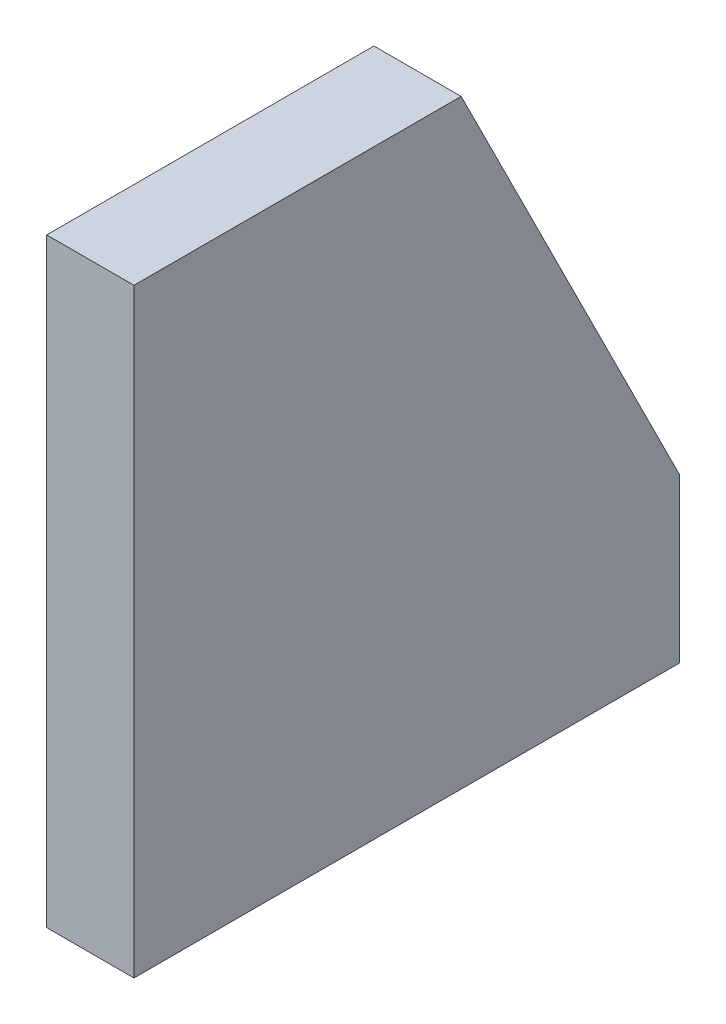
ISO-10303-21;
HEADER;
FILE_DESCRIPTION(('STEP AP214'),'2;1');
FILE_NAME('part.step','',(''),(''),'','','');
FILE_SCHEMA(('AUTOMOTIVE_DESIGN { 1 0 10303 214 1 1 1 1 }'));
ENDSEC;
DATA;
#1=APPLICATION_CONTEXT('core data for automotive mechanical design processes');
#2=APPLICATION_PROTOCOL_DEFINITION('international standard','automotive_design',2000,#1);
#3=PRODUCT_CONTEXT('',#1,'mechanical');
#4=PRODUCT('Part','Part','',(#3));
#5=PRODUCT_RELATED_PRODUCT_CATEGORY('part','',(#4));
#6=PRODUCT_DEFINITION_FORMATION('','',#4);
#7=PRODUCT_DEFINITION_CONTEXT('part definition',#1,'design');
#8=PRODUCT_DEFINITION('design','',#6,#7);
#9=PRODUCT_DEFINITION_SHAPE('','',#8);
#10=(LENGTH_UNIT() NAMED_UNIT(*) SI_UNIT(.MILLI.,.METRE.));
#11=(NAMED_UNIT(*) PLANE_ANGLE_UNIT() SI_UNIT($,.RADIAN.));
#12=(NAMED_UNIT(*) SI_UNIT($,.STERADIAN.) SOLID_ANGLE_UNIT());
#13=UNCERTAINTY_MEASURE_WITH_UNIT(LENGTH_MEASURE(1.E-05),#10,'distance_accuracy_value','');
#14=(GEOMETRIC_REPRESENTATION_CONTEXT(3) GLOBAL_UNCERTAINTY_ASSIGNED_CONTEXT((#13)) GLOBAL_UNIT_ASSIGNED_CONTEXT((#10,
#11,#12)) REPRESENTATION_CONTEXT('',''));
#15=CARTESIAN_POINT('',(0.,0.,0.));
#16=DIRECTION('',(0.,0.,1.));
#17=DIRECTION('',(1.,0.,0.));
#18=AXIS2_PLACEMENT_3D('',#15,#16,#17);
#19=CARTESIAN_POINT('',(8.,3.63636363636363,-6.16883116883118));
#20=DIRECTION('',(0.,0.,1.));
#21=DIRECTION('',(0.,-1.,0.));
#22=AXIS2_PLACEMENT_3D('',#19,#20,#21);
#23=PLANE('',#22);
#24=DIRECTION('',(0.,1.,0.));
#25=VECTOR('',#24,1.);
#26=CARTESIAN_POINT('',(0.,3.63636363636363,-6.16883116883118));
#27=LINE('',#26,#25);
#28=CARTESIAN_POINT('',(0.,-11.3636363636364,-6.16883116883118));
#29=VERTEX_POINT('',#28);
#30=CARTESIAN_POINT('',(0.,3.63636363636363,-6.16883116883118));
#31=VERTEX_POINT('',#30);
#32=EDGE_CURVE('E106',#29,#31,#27,.T.);
#33=ORIENTED_EDGE('',*,*,#32,.T.);
#34=DIRECTION('',(-1.,0.,0.));
#35=VECTOR('',#34,1.);
#36=CARTESIAN_POINT('',(8.,3.63636363636363,-6.16883116883118));
#37=LINE('',#36,#35);
#38=CARTESIAN_POINT('',(8.,3.63636363636363,-6.16883116883118));
#39=VERTEX_POINT('',#38);
#40=EDGE_CURVE('E11',#39,#31,#37,.T.);
#41=ORIENTED_EDGE('',*,*,#40,.F.);
#42=DIRECTION('',(0.,1.,0.));
#43=VECTOR('',#42,1.);
#44=CARTESIAN_POINT('',(8.,3.63636363636363,-6.16883116883118));
#45=LINE('',#44,#43);
#46=CARTESIAN_POINT('',(8.,-11.3636363636364,-6.16883116883118));
#47=VERTEX_POINT('',#46);
#48=EDGE_CURVE('E114',#47,#39,#45,.T.);
#49=ORIENTED_EDGE('',*,*,#48,.F.);
#50=DIRECTION('',(-1.,0.,0.));
#51=VECTOR('',#50,1.);
#52=CARTESIAN_POINT('',(8.,-11.3636363636364,-6.16883116883118));
#53=LINE('',#52,#51);
#54=EDGE_CURVE('E102',#47,#29,#53,.T.);
#55=ORIENTED_EDGE('',*,*,#54,.T.);
#56=EDGE_LOOP('',(#33,#41,#49,#55));
#57=FACE_BOUND('',#56,.T.);
#58=ADVANCED_FACE('F32',(#57),#23,.F.);
#59=CARTESIAN_POINT('',(8.,43.6363636363636,13.8311688311688));
#60=DIRECTION('',(0.,-0.447213595499958,0.894427190999916));
#61=DIRECTION('',(0.,-0.894427190999916,-0.447213595499958));
#62=AXIS2_PLACEMENT_3D('',#59,#60,#61);
#63=PLANE('',#62);
#64=DIRECTION('',(0.,0.894427190999916,0.447213595499958));
#65=VECTOR('',#64,1.);
#66=CARTESIAN_POINT('',(0.,43.6363636363636,13.8311688311688));
#67=LINE('',#66,#65);
#68=CARTESIAN_POINT('',(0.,43.6363636363636,13.8311688311688));
#69=VERTEX_POINT('',#68);
#70=EDGE_CURVE('E109',#31,#69,#67,.T.);
#71=ORIENTED_EDGE('',*,*,#70,.T.);
#72=DIRECTION('',(-1.,0.,0.));
#73=VECTOR('',#72,1.);
#74=CARTESIAN_POINT('',(8.,43.6363636363636,13.8311688311688));
#75=LINE('',#74,#73);
#76=CARTESIAN_POINT('',(8.,43.6363636363636,13.8311688311688));
#77=VERTEX_POINT('',#76);
#78=EDGE_CURVE('E40',#77,#69,#75,.T.);
#79=ORIENTED_EDGE('',*,*,#78,.F.);
#80=DIRECTION('',(0.,0.894427190999916,0.447213595499958));
#81=VECTOR('',#80,1.);
#82=CARTESIAN_POINT('',(8.,43.6363636363636,13.8311688311688));
#83=LINE('',#82,#81);
#84=EDGE_CURVE('E82',#39,#77,#83,.T.);
#85=ORIENTED_EDGE('',*,*,#84,.F.);
#86=ORIENTED_EDGE('',*,*,#40,.T.);
#87=EDGE_LOOP('',(#71,#79,#85,#86));
#88=FACE_BOUND('',#87,.T.);
#89=ADVANCED_FACE('F133',(#88),#63,.F.);
#90=CARTESIAN_POINT('',(8.,43.6363636363636,43.8311688311688));
#91=DIRECTION('',(0.,-1.,0.));
#92=DIRECTION('',(0.,0.,-1.));
#93=AXIS2_PLACEMENT_3D('',#90,#91,#92);
#94=PLANE('',#93);
#95=DIRECTION('',(0.,0.,1.));
#96=VECTOR('',#95,1.);
#97=CARTESIAN_POINT('',(0.,43.6363636363636,43.8311688311688));
#98=LINE('',#97,#96);
#99=CARTESIAN_POINT('',(0.,43.6363636363636,43.8311688311688));
#100=VERTEX_POINT('',#99);
#101=EDGE_CURVE('E97',#69,#100,#98,.T.);
#102=ORIENTED_EDGE('',*,*,#101,.T.);
#103=DIRECTION('',(-1.,0.,0.));
#104=VECTOR('',#103,1.);
#105=CARTESIAN_POINT('',(8.,43.6363636363636,43.8311688311688));
#106=LINE('',#105,#104);
#107=CARTESIAN_POINT('',(8.,43.6363636363636,43.8311688311688));
#108=VERTEX_POINT('',#107);
#109=EDGE_CURVE('E94',#108,#100,#106,.T.);
#110=ORIENTED_EDGE('',*,*,#109,.F.);
#111=DIRECTION('',(0.,0.,1.));
#112=VECTOR('',#111,1.);
#113=CARTESIAN_POINT('',(8.,43.6363636363636,43.8311688311688));
#114=LINE('',#113,#112);
#115=EDGE_CURVE('E86',#77,#108,#114,.T.);
#116=ORIENTED_EDGE('',*,*,#115,.F.);
#117=ORIENTED_EDGE('',*,*,#78,.T.);
#118=EDGE_LOOP('',(#102,#110,#116,#117));
#119=FACE_BOUND('',#118,.T.);
#120=ADVANCED_FACE('F95',(#119),#94,.F.);
#121=CARTESIAN_POINT('',(8.,-11.3636363636364,43.8311688311688));
#122=DIRECTION('',(0.,0.,-1.));
#123=DIRECTION('',(-1.,0.,0.));
#124=AXIS2_PLACEMENT_3D('',#121,#122,#123);
#125=PLANE('',#124);
#126=DIRECTION('',(0.,-1.,0.));
#127=VECTOR('',#126,1.);
#128=CARTESIAN_POINT('',(0.,-11.3636363636364,43.8311688311688));
#129=LINE('',#128,#127);
#130=CARTESIAN_POINT('',(0.,-11.3636363636364,43.8311688311688));
#131=VERTEX_POINT('',#130);
#132=EDGE_CURVE('E68',#100,#131,#129,.T.);
#133=ORIENTED_EDGE('',*,*,#132,.T.);
#134=DIRECTION('',(-1.,0.,0.));
#135=VECTOR('',#134,1.);
#136=CARTESIAN_POINT('',(8.,-11.3636363636364,43.8311688311688));
#137=LINE('',#136,#135);
#138=CARTESIAN_POINT('',(8.,-11.3636363636364,43.8311688311688));
#139=VERTEX_POINT('',#138);
#140=EDGE_CURVE('E98',#139,#131,#137,.T.);
#141=ORIENTED_EDGE('',*,*,#140,.F.);
#142=DIRECTION('',(0.,-1.,0.));
#143=VECTOR('',#142,1.);
#144=CARTESIAN_POINT('',(8.,-11.3636363636364,43.8311688311688));
#145=LINE('',#144,#143);
#146=EDGE_CURVE('E90',#108,#139,#145,.T.);
#147=ORIENTED_EDGE('',*,*,#146,.F.);
#148=ORIENTED_EDGE('',*,*,#109,.T.);
#149=EDGE_LOOP('',(#133,#141,#147,#148));
#150=FACE_BOUND('',#149,.T.);
#151=ADVANCED_FACE('F100',(#150),#125,.F.);
#152=CARTESIAN_POINT('',(8.,-11.3636363636364,-6.16883116883118));
#153=DIRECTION('',(0.,1.,0.));
#154=DIRECTION('',(0.,0.,1.));
#155=AXIS2_PLACEMENT_3D('',#152,#153,#154);
#156=PLANE('',#155);
#157=DIRECTION('',(0.,0.,-1.));
#158=VECTOR('',#157,1.);
#159=CARTESIAN_POINT('',(0.,-11.3636363636364,-6.16883116883118));
#160=LINE('',#159,#158);
#161=EDGE_CURVE('E74',#131,#29,#160,.T.);
#162=ORIENTED_EDGE('',*,*,#161,.T.);
#163=ORIENTED_EDGE('',*,*,#54,.F.);
#164=DIRECTION('',(0.,0.,-1.));
#165=VECTOR('',#164,1.);
#166=CARTESIAN_POINT('',(8.,-11.3636363636364,-6.16883116883118));
#167=LINE('',#166,#165);
#168=EDGE_CURVE('E48',#139,#47,#167,.T.);
#169=ORIENTED_EDGE('',*,*,#168,.F.);
#170=ORIENTED_EDGE('',*,*,#140,.T.);
#171=EDGE_LOOP('',(#162,#163,#169,#170));
#172=FACE_BOUND('',#171,.T.);
#173=ADVANCED_FACE('F122',(#172),#156,.F.);
#174=CARTESIAN_POINT('',(8.,0.,0.));
#175=DIRECTION('',(-1.,0.,0.));
#176=DIRECTION('',(0.,0.,1.));
#177=AXIS2_PLACEMENT_3D('',#174,#175,#176);
#178=PLANE('',#177);
#179=ORIENTED_EDGE('',*,*,#48,.T.);
#180=ORIENTED_EDGE('',*,*,#84,.T.);
#181=ORIENTED_EDGE('',*,*,#115,.T.);
#182=ORIENTED_EDGE('',*,*,#146,.T.);
#183=ORIENTED_EDGE('',*,*,#168,.T.);
#184=EDGE_LOOP('',(#179,#180,#181,#182,#183));
#185=FACE_BOUND('',#184,.T.);
#186=ADVANCED_FACE('F88',(#185),#178,.F.);
#187=CARTESIAN_POINT('',(0.,0.,0.));
#188=DIRECTION('',(-1.,0.,0.));
#189=DIRECTION('',(0.,0.,1.));
#190=AXIS2_PLACEMENT_3D('',#187,#188,#189);
#191=PLANE('',#190);
#192=ORIENTED_EDGE('',*,*,#32,.F.);
#193=ORIENTED_EDGE('',*,*,#161,.F.);
#194=ORIENTED_EDGE('',*,*,#132,.F.);
#195=ORIENTED_EDGE('',*,*,#101,.F.);
#196=ORIENTED_EDGE('',*,*,#70,.F.);
#197=EDGE_LOOP('',(#192,#193,#194,#195,#196));
#198=FACE_BOUND('',#197,.T.);
#199=ADVANCED_FACE('F118',(#198),#191,.T.);
#200=CLOSED_SHELL('',(#58,#89,#120,#151,#173,#186,#199));
#201=MANIFOLD_SOLID_BREP('B2',#200);
#202=ADVANCED_BREP_SHAPE_REPRESENTATION('',(#18,#201),#14);
#203=SHAPE_DEFINITION_REPRESENTATION(#9,#202);
ENDSEC;
END-ISO-10303-21;
